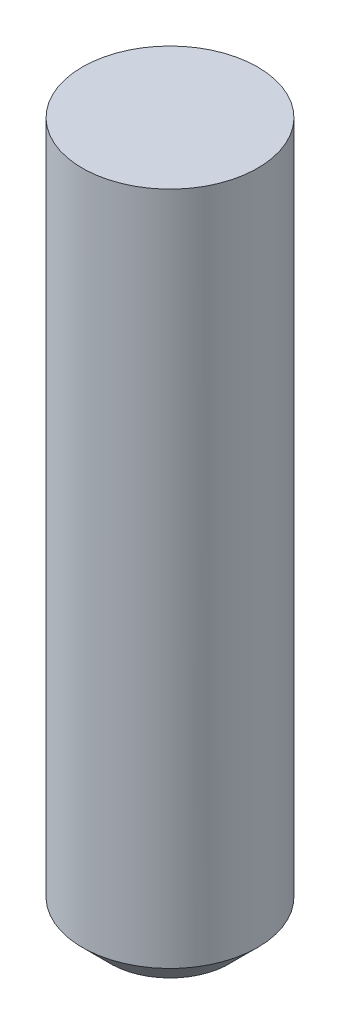
ISO-10303-21;
HEADER;
FILE_DESCRIPTION(('STEP AP214'),'2;1');
FILE_NAME('part.step','',(''),(''),'','','');
FILE_SCHEMA(('AUTOMOTIVE_DESIGN { 1 0 10303 214 1 1 1 1 }'));
ENDSEC;
DATA;
#1=APPLICATION_CONTEXT('core data for automotive mechanical design processes');
#2=APPLICATION_PROTOCOL_DEFINITION('international standard','automotive_design',2000,#1);
#3=PRODUCT_CONTEXT('',#1,'mechanical');
#4=PRODUCT('Part','Part','',(#3));
#5=PRODUCT_RELATED_PRODUCT_CATEGORY('part','',(#4));
#6=PRODUCT_DEFINITION_FORMATION('','',#4);
#7=PRODUCT_DEFINITION_CONTEXT('part definition',#1,'design');
#8=PRODUCT_DEFINITION('design','',#6,#7);
#9=PRODUCT_DEFINITION_SHAPE('','',#8);
#10=(LENGTH_UNIT() NAMED_UNIT(*) SI_UNIT(.MILLI.,.METRE.));
#11=(NAMED_UNIT(*) PLANE_ANGLE_UNIT() SI_UNIT($,.RADIAN.));
#12=(NAMED_UNIT(*) SI_UNIT($,.STERADIAN.) SOLID_ANGLE_UNIT());
#13=UNCERTAINTY_MEASURE_WITH_UNIT(LENGTH_MEASURE(1.E-05),#10,'distance_accuracy_value','');
#14=(GEOMETRIC_REPRESENTATION_CONTEXT(3) GLOBAL_UNCERTAINTY_ASSIGNED_CONTEXT((#13)) GLOBAL_UNIT_ASSIGNED_CONTEXT((#10,
#11,#12)) REPRESENTATION_CONTEXT('',''));
#15=CARTESIAN_POINT('',(0.,0.,0.));
#16=DIRECTION('',(0.,0.,1.));
#17=DIRECTION('',(1.,0.,0.));
#18=AXIS2_PLACEMENT_3D('',#15,#16,#17);
#19=CARTESIAN_POINT('',(0.,0.508000000000002,0.));
#20=DIRECTION('',(0.,1.,0.));
#21=DIRECTION('',(-1.,0.,0.));
#22=AXIS2_PLACEMENT_3D('',#19,#20,#21);
#23=CONICAL_SURFACE('',#22,1.5836899999933,0.785398163397448);
#24=CARTESIAN_POINT('',(0.,0.,0.));
#25=DIRECTION('',(0.,1.,0.));
#26=DIRECTION('',(-1.,0.,0.));
#27=AXIS2_PLACEMENT_3D('',#24,#25,#26);
#28=CIRCLE('',#27,1.0756899999933);
#29=CARTESIAN_POINT('',(-1.0756899999933,0.,0.));
#30=VERTEX_POINT('',#29);
#31=EDGE_CURVE('E42',#30,#30,#28,.T.);
#32=ORIENTED_EDGE('',*,*,#31,.T.);
#33=EDGE_LOOP('',(#32));
#34=FACE_BOUND('',#33,.T.);
#35=CARTESIAN_POINT('',(0.,0.508000000000002,0.));
#36=DIRECTION('',(0.,1.,0.));
#37=DIRECTION('',(-1.,0.,0.));
#38=AXIS2_PLACEMENT_3D('',#35,#36,#37);
#39=CIRCLE('',#38,1.5836899999933);
#40=CARTESIAN_POINT('',(-1.5836899999933,0.508000000000002,0.));
#41=VERTEX_POINT('',#40);
#42=EDGE_CURVE('E38',#41,#41,#39,.T.);
#43=ORIENTED_EDGE('',*,*,#42,.F.);
#44=EDGE_LOOP('',(#43));
#45=FACE_BOUND('',#44,.T.);
#46=ADVANCED_FACE('F32',(#34,#45),#23,.T.);
#47=CARTESIAN_POINT('',(0.,0.,0.));
#48=DIRECTION('',(0.,1.,0.));
#49=DIRECTION('',(-1.,0.,0.));
#50=AXIS2_PLACEMENT_3D('',#47,#48,#49);
#51=CYLINDRICAL_SURFACE('',#50,1.5836899999933);
#52=CARTESIAN_POINT('',(0.,12.6999999999953,0.));
#53=DIRECTION('',(0.,-1.,0.));
#54=DIRECTION('',(0.,0.,-1.));
#55=AXIS2_PLACEMENT_3D('',#52,#53,#54);
#56=CIRCLE('',#55,1.5836899999933);
#57=CARTESIAN_POINT('',(0.,12.6999999999953,-1.5836899999933));
#58=VERTEX_POINT('',#57);
#59=EDGE_CURVE('E10',#58,#58,#56,.F.);
#60=ORIENTED_EDGE('',*,*,#59,.F.);
#61=EDGE_LOOP('',(#60));
#62=FACE_BOUND('',#61,.T.);
#63=ORIENTED_EDGE('',*,*,#42,.T.);
#64=EDGE_LOOP('',(#63));
#65=FACE_BOUND('',#64,.T.);
#66=ADVANCED_FACE('F54',(#62,#65),#51,.T.);
#67=CARTESIAN_POINT('',(1.0756899999933,0.,0.));
#68=DIRECTION('',(0.,-1.,0.));
#69=DIRECTION('',(1.,0.,0.));
#70=AXIS2_PLACEMENT_3D('',#67,#68,#69);
#71=PLANE('',#70);
#72=ORIENTED_EDGE('',*,*,#31,.F.);
#73=EDGE_LOOP('',(#72));
#74=FACE_BOUND('',#73,.T.);
#75=ADVANCED_FACE('F51',(#74),#71,.T.);
#76=CARTESIAN_POINT('',(2.54746878107426,12.6999999999953,-1.58368999999331));
#77=DIRECTION('',(0.,-1.,0.));
#78=DIRECTION('',(0.,0.,-1.));
#79=AXIS2_PLACEMENT_3D('',#76,#77,#78);
#80=PLANE('',#79);
#81=ORIENTED_EDGE('',*,*,#59,.T.);
#82=EDGE_LOOP('',(#81));
#83=FACE_BOUND('',#82,.T.);
#84=ADVANCED_FACE('F53',(#83),#80,.F.);
#85=CLOSED_SHELL('',(#46,#66,#75,#84));
#86=MANIFOLD_SOLID_BREP('B2',#85);
#87=ADVANCED_BREP_SHAPE_REPRESENTATION('',(#18,#86),#14);
#88=SHAPE_DEFINITION_REPRESENTATION(#9,#87);
ENDSEC;
END-ISO-10303-21;
